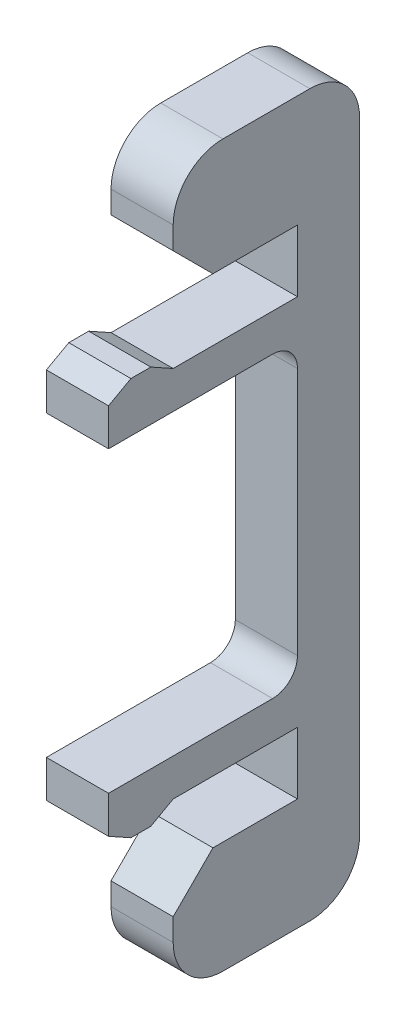
ISO-10303-21;
HEADER;
FILE_DESCRIPTION(('STEP AP214'),'2;1');
FILE_NAME('part.step','',(''),(''),'','','');
FILE_SCHEMA(('AUTOMOTIVE_DESIGN { 1 0 10303 214 1 1 1 1 }'));
ENDSEC;
DATA;
#1=APPLICATION_CONTEXT('core data for automotive mechanical design processes');
#2=APPLICATION_PROTOCOL_DEFINITION('international standard','automotive_design',2000,#1);
#3=PRODUCT_CONTEXT('',#1,'mechanical');
#4=PRODUCT('Part','Part','',(#3));
#5=PRODUCT_RELATED_PRODUCT_CATEGORY('part','',(#4));
#6=PRODUCT_DEFINITION_FORMATION('','',#4);
#7=PRODUCT_DEFINITION_CONTEXT('part definition',#1,'design');
#8=PRODUCT_DEFINITION('design','',#6,#7);
#9=PRODUCT_DEFINITION_SHAPE('','',#8);
#10=(LENGTH_UNIT() NAMED_UNIT(*) SI_UNIT(.MILLI.,.METRE.));
#11=(NAMED_UNIT(*) PLANE_ANGLE_UNIT() SI_UNIT($,.RADIAN.));
#12=(NAMED_UNIT(*) SI_UNIT($,.STERADIAN.) SOLID_ANGLE_UNIT());
#13=UNCERTAINTY_MEASURE_WITH_UNIT(LENGTH_MEASURE(1.E-05),#10,'distance_accuracy_value','');
#14=(GEOMETRIC_REPRESENTATION_CONTEXT(3) GLOBAL_UNCERTAINTY_ASSIGNED_CONTEXT((#13)) GLOBAL_UNIT_ASSIGNED_CONTEXT((#10,
#11,#12)) REPRESENTATION_CONTEXT('',''));
#15=CARTESIAN_POINT('',(0.,0.,0.));
#16=DIRECTION('',(0.,0.,1.));
#17=DIRECTION('',(1.,0.,0.));
#18=AXIS2_PLACEMENT_3D('',#15,#16,#17);
#19=CARTESIAN_POINT('',(0.,0.,3.175));
#20=DIRECTION('',(0.,0.,-1.));
#21=DIRECTION('',(-1.,0.,0.));
#22=AXIS2_PLACEMENT_3D('',#19,#20,#21);
#23=PLANE('',#22);
#24=DIRECTION('',(0.,-1.,0.));
#25=VECTOR('',#24,1.);
#26=CARTESIAN_POINT('',(-1.5875,-18.415,3.175));
#27=LINE('',#26,#25);
#28=CARTESIAN_POINT('',(-1.5875,12.7,3.175));
#29=VERTEX_POINT('',#28);
#30=CARTESIAN_POINT('',(-1.5875,9.525,3.175));
#31=VERTEX_POINT('',#30);
#32=EDGE_CURVE('E365',#29,#31,#27,.T.);
#33=ORIENTED_EDGE('',*,*,#32,.T.);
#34=DIRECTION('',(-1.,0.,0.));
#35=VECTOR('',#34,1.);
#36=CARTESIAN_POINT('',(11.5681164138294,9.525,3.175));
#37=LINE('',#36,#35);
#38=CARTESIAN_POINT('',(1.5875,9.525,3.175));
#39=VERTEX_POINT('',#38);
#40=EDGE_CURVE('E279',#39,#31,#37,.T.);
#41=ORIENTED_EDGE('',*,*,#40,.F.);
#42=DIRECTION('',(0.,1.,0.));
#43=VECTOR('',#42,1.);
#44=CARTESIAN_POINT('',(1.5875,-18.415,3.175));
#45=LINE('',#44,#43);
#46=CARTESIAN_POINT('',(1.5875,12.7,3.175));
#47=VERTEX_POINT('',#46);
#48=EDGE_CURVE('E364',#39,#47,#45,.T.);
#49=ORIENTED_EDGE('',*,*,#48,.T.);
#50=DIRECTION('',(-1.,0.,0.));
#51=VECTOR('',#50,1.);
#52=CARTESIAN_POINT('',(10.1305512698918,12.7,3.175));
#53=LINE('',#52,#51);
#54=EDGE_CURVE('E339',#47,#29,#53,.T.);
#55=ORIENTED_EDGE('',*,*,#54,.T.);
#56=EDGE_LOOP('',(#33,#41,#49,#55));
#57=FACE_BOUND('',#56,.T.);
#58=ADVANCED_FACE('F41',(#57),#23,.F.);
#59=CARTESIAN_POINT('',(-1.5875,6.35,3.175));
#60=VERTEX_POINT('',#59);
#61=CARTESIAN_POINT('',(-1.5875,-6.35,3.175));
#62=VERTEX_POINT('',#61);
#63=EDGE_CURVE('E368',#60,#62,#27,.T.);
#64=ORIENTED_EDGE('',*,*,#63,.T.);
#65=DIRECTION('',(-1.,0.,0.));
#66=VECTOR('',#65,1.);
#67=CARTESIAN_POINT('',(0.,-6.35,3.175));
#68=LINE('',#67,#66);
#69=CARTESIAN_POINT('',(1.5875,-6.35,3.175));
#70=VERTEX_POINT('',#69);
#71=EDGE_CURVE('E391',#62,#70,#68,.F.);
#72=ORIENTED_EDGE('',*,*,#71,.T.);
#73=CARTESIAN_POINT('',(1.5875,6.35,3.175));
#74=VERTEX_POINT('',#73);
#75=EDGE_CURVE('E363',#70,#74,#45,.T.);
#76=ORIENTED_EDGE('',*,*,#75,.T.);
#77=DIRECTION('',(-1.,0.,0.));
#78=VECTOR('',#77,1.);
#79=CARTESIAN_POINT('',(0.,6.35,3.175));
#80=LINE('',#79,#78);
#81=EDGE_CURVE('E388',#74,#60,#80,.T.);
#82=ORIENTED_EDGE('',*,*,#81,.T.);
#83=EDGE_LOOP('',(#64,#72,#76,#82));
#84=FACE_BOUND('',#83,.T.);
#85=ADVANCED_FACE('F497',(#84),#23,.F.);
#86=CARTESIAN_POINT('',(1.5875,-12.7,3.175));
#87=VERTEX_POINT('',#86);
#88=CARTESIAN_POINT('',(1.5875,-9.525,3.175));
#89=VERTEX_POINT('',#88);
#90=EDGE_CURVE('E360',#87,#89,#45,.T.);
#91=ORIENTED_EDGE('',*,*,#90,.T.);
#92=DIRECTION('',(-1.,0.,0.));
#93=VECTOR('',#92,1.);
#94=CARTESIAN_POINT('',(11.5681164138294,-9.525,3.175));
#95=LINE('',#94,#93);
#96=CARTESIAN_POINT('',(-1.5875,-9.525,3.175));
#97=VERTEX_POINT('',#96);
#98=EDGE_CURVE('E297',#89,#97,#95,.T.);
#99=ORIENTED_EDGE('',*,*,#98,.T.);
#100=CARTESIAN_POINT('',(-1.5875,-12.7,3.175));
#101=VERTEX_POINT('',#100);
#102=EDGE_CURVE('E362',#97,#101,#27,.T.);
#103=ORIENTED_EDGE('',*,*,#102,.T.);
#104=DIRECTION('',(-1.,0.,0.));
#105=VECTOR('',#104,1.);
#106=CARTESIAN_POINT('',(10.1305512698918,-12.7,3.175));
#107=LINE('',#106,#105);
#108=EDGE_CURVE('E350',#87,#101,#107,.T.);
#109=ORIENTED_EDGE('',*,*,#108,.F.);
#110=EDGE_LOOP('',(#91,#99,#103,#109));
#111=FACE_BOUND('',#110,.T.);
#112=ADVANCED_FACE('F499',(#111),#23,.F.);
#113=CARTESIAN_POINT('',(1.5875,-18.415,3.175));
#114=DIRECTION('',(-1.,0.,0.));
#115=DIRECTION('',(0.,0.,1.));
#116=AXIS2_PLACEMENT_3D('',#113,#114,#115);
#117=PLANE('',#116);
#118=DIRECTION('',(0.,0.,1.));
#119=VECTOR('',#118,1.);
#120=CARTESIAN_POINT('',(1.5875,-12.7,3.175));
#121=LINE('',#120,#119);
#122=CARTESIAN_POINT('',(1.5875,-12.7,7.49299999999999));
#123=VERTEX_POINT('',#122);
#124=EDGE_CURVE('E291',#87,#123,#121,.T.);
#125=ORIENTED_EDGE('',*,*,#124,.T.);
#126=DIRECTION('',(0.,0.707106781186546,-0.707106781186549));
#127=VECTOR('',#126,1.);
#128=CARTESIAN_POINT('',(1.5875,-14.732,9.525));
#129=LINE('',#128,#127);
#130=CARTESIAN_POINT('',(1.5875,-14.732,9.525));
#131=VERTEX_POINT('',#130);
#132=EDGE_CURVE('E449',#123,#131,#129,.F.);
#133=ORIENTED_EDGE('',*,*,#132,.T.);
#134=DIRECTION('',(0.,-1.,0.));
#135=VECTOR('',#134,1.);
#136=CARTESIAN_POINT('',(1.5875,-18.415,9.525));
#137=LINE('',#136,#135);
#138=CARTESIAN_POINT('',(1.5875,-15.875,9.525));
#139=VERTEX_POINT('',#138);
#140=EDGE_CURVE('E354',#131,#139,#137,.T.);
#141=ORIENTED_EDGE('',*,*,#140,.T.);
#142=CARTESIAN_POINT('',(1.5875,-15.875,6.985));
#143=DIRECTION('',(-1.,0.,0.));
#144=DIRECTION('',(0.,0.,1.));
#145=AXIS2_PLACEMENT_3D('',#142,#143,#144);
#146=CIRCLE('',#145,2.54);
#147=CARTESIAN_POINT('',(1.5875,-18.415,6.985));
#148=VERTEX_POINT('',#147);
#149=EDGE_CURVE('E425',#139,#148,#146,.F.);
#150=ORIENTED_EDGE('',*,*,#149,.T.);
#151=DIRECTION('',(0.,0.,-1.));
#152=VECTOR('',#151,1.);
#153=CARTESIAN_POINT('',(1.5875,-18.415,3.175));
#154=LINE('',#153,#152);
#155=CARTESIAN_POINT('',(1.5875,-18.415,2.54));
#156=VERTEX_POINT('',#155);
#157=EDGE_CURVE('E367',#148,#156,#154,.T.);
#158=ORIENTED_EDGE('',*,*,#157,.T.);
#159=CARTESIAN_POINT('',(1.5875,-15.875,2.54));
#160=DIRECTION('',(-1.,0.,0.));
#161=DIRECTION('',(0.,0.,1.));
#162=AXIS2_PLACEMENT_3D('',#159,#160,#161);
#163=CIRCLE('',#162,2.54);
#164=CARTESIAN_POINT('',(1.5875,-15.875,0.));
#165=VERTEX_POINT('',#164);
#166=EDGE_CURVE('E419',#156,#165,#163,.F.);
#167=ORIENTED_EDGE('',*,*,#166,.T.);
#168=DIRECTION('',(0.,1.,0.));
#169=VECTOR('',#168,1.);
#170=CARTESIAN_POINT('',(1.5875,-18.415,0.));
#171=LINE('',#170,#169);
#172=CARTESIAN_POINT('',(1.5875,15.875,0.));
#173=VERTEX_POINT('',#172);
#174=EDGE_CURVE('E349',#165,#173,#171,.T.);
#175=ORIENTED_EDGE('',*,*,#174,.T.);
#176=CARTESIAN_POINT('',(1.5875,15.875,2.54));
#177=DIRECTION('',(-1.,0.,0.));
#178=DIRECTION('',(0.,0.,1.));
#179=AXIS2_PLACEMENT_3D('',#176,#177,#178);
#180=CIRCLE('',#179,2.54);
#181=CARTESIAN_POINT('',(1.5875,18.415,2.54));
#182=VERTEX_POINT('',#181);
#183=EDGE_CURVE('E421',#173,#182,#180,.F.);
#184=ORIENTED_EDGE('',*,*,#183,.T.);
#185=DIRECTION('',(0.,0.,-1.));
#186=VECTOR('',#185,1.);
#187=CARTESIAN_POINT('',(1.5875,18.415,3.175));
#188=LINE('',#187,#186);
#189=CARTESIAN_POINT('',(1.5875,18.415,6.985));
#190=VERTEX_POINT('',#189);
#191=EDGE_CURVE('E382',#190,#182,#188,.T.);
#192=ORIENTED_EDGE('',*,*,#191,.F.);
#193=CARTESIAN_POINT('',(1.5875,15.875,6.985));
#194=DIRECTION('',(-1.,0.,0.));
#195=DIRECTION('',(0.,0.,1.));
#196=AXIS2_PLACEMENT_3D('',#193,#194,#195);
#197=CIRCLE('',#196,2.54);
#198=CARTESIAN_POINT('',(1.5875,15.875,9.525));
#199=VERTEX_POINT('',#198);
#200=EDGE_CURVE('E423',#190,#199,#197,.F.);
#201=ORIENTED_EDGE('',*,*,#200,.T.);
#202=DIRECTION('',(0.,-1.,0.));
#203=VECTOR('',#202,1.);
#204=CARTESIAN_POINT('',(1.5875,18.415,9.525));
#205=LINE('',#204,#203);
#206=CARTESIAN_POINT('',(1.5875,14.732,9.525));
#207=VERTEX_POINT('',#206);
#208=EDGE_CURVE('E336',#199,#207,#205,.T.);
#209=ORIENTED_EDGE('',*,*,#208,.T.);
#210=DIRECTION('',(0.,0.707106781186549,0.707106781186546));
#211=VECTOR('',#210,1.);
#212=CARTESIAN_POINT('',(1.5875,12.7,7.493));
#213=LINE('',#212,#211);
#214=CARTESIAN_POINT('',(1.5875,12.7,7.493));
#215=VERTEX_POINT('',#214);
#216=EDGE_CURVE('E57',#207,#215,#213,.F.);
#217=ORIENTED_EDGE('',*,*,#216,.T.);
#218=DIRECTION('',(0.,0.,-1.));
#219=VECTOR('',#218,1.);
#220=CARTESIAN_POINT('',(1.5875,12.7,3.175));
#221=LINE('',#220,#219);
#222=EDGE_CURVE('E338',#215,#47,#221,.T.);
#223=ORIENTED_EDGE('',*,*,#222,.T.);
#224=ORIENTED_EDGE('',*,*,#48,.F.);
#225=DIRECTION('',(0.,0.,1.));
#226=VECTOR('',#225,1.);
#227=CARTESIAN_POINT('',(1.5875,9.525,3.175));
#228=LINE('',#227,#226);
#229=CARTESIAN_POINT('',(1.5875,9.525,9.525));
#230=VERTEX_POINT('',#229);
#231=EDGE_CURVE('E292',#39,#230,#228,.T.);
#232=ORIENTED_EDGE('',*,*,#231,.T.);
#233=DIRECTION('',(0.,0.485642931178632,0.874157276121538));
#234=VECTOR('',#233,1.);
#235=CARTESIAN_POINT('',(1.5875,9.525,9.525));
#236=LINE('',#235,#234);
#237=CARTESIAN_POINT('',(1.5875,10.16,10.668));
#238=VERTEX_POINT('',#237);
#239=EDGE_CURVE('E466',#230,#238,#236,.T.);
#240=ORIENTED_EDGE('',*,*,#239,.T.);
#241=DIRECTION('',(0.,0.,1.));
#242=VECTOR('',#241,1.);
#243=CARTESIAN_POINT('',(1.5875,10.16,10.668));
#244=LINE('',#243,#242);
#245=CARTESIAN_POINT('',(1.5875,10.16,11.684));
#246=VERTEX_POINT('',#245);
#247=EDGE_CURVE('E467',#238,#246,#244,.T.);
#248=ORIENTED_EDGE('',*,*,#247,.T.);
#249=DIRECTION('',(0.,-0.485642931178633,0.874157276121537));
#250=VECTOR('',#249,1.);
#251=CARTESIAN_POINT('',(1.5875,10.16,11.684));
#252=LINE('',#251,#250);
#253=CARTESIAN_POINT('',(1.5875,9.525,12.827));
#254=VERTEX_POINT('',#253);
#255=EDGE_CURVE('E471',#246,#254,#252,.T.);
#256=ORIENTED_EDGE('',*,*,#255,.T.);
#257=DIRECTION('',(0.,-1.,0.));
#258=VECTOR('',#257,1.);
#259=CARTESIAN_POINT('',(1.5875,9.525,12.827));
#260=LINE('',#259,#258);
#261=CARTESIAN_POINT('',(1.5875,7.62,12.827));
#262=VERTEX_POINT('',#261);
#263=EDGE_CURVE('E282',#254,#262,#260,.T.);
#264=ORIENTED_EDGE('',*,*,#263,.T.);
#265=DIRECTION('',(0.,0.,-1.));
#266=VECTOR('',#265,1.);
#267=CARTESIAN_POINT('',(1.5875,7.62,12.827));
#268=LINE('',#267,#266);
#269=CARTESIAN_POINT('',(1.5875,7.62,4.445));
#270=VERTEX_POINT('',#269);
#271=EDGE_CURVE('E257',#262,#270,#268,.T.);
#272=ORIENTED_EDGE('',*,*,#271,.T.);
#273=CARTESIAN_POINT('',(1.5875,6.35,4.445));
#274=DIRECTION('',(-1.,0.,0.));
#275=DIRECTION('',(0.,0.,1.));
#276=AXIS2_PLACEMENT_3D('',#273,#274,#275);
#277=CIRCLE('',#276,1.27);
#278=EDGE_CURVE('E400',#270,#74,#277,.T.);
#279=ORIENTED_EDGE('',*,*,#278,.T.);
#280=ORIENTED_EDGE('',*,*,#75,.F.);
#281=CARTESIAN_POINT('',(1.5875,-6.35,4.445));
#282=DIRECTION('',(-1.,0.,0.));
#283=DIRECTION('',(0.,0.,1.));
#284=AXIS2_PLACEMENT_3D('',#281,#282,#283);
#285=CIRCLE('',#284,1.27);
#286=CARTESIAN_POINT('',(1.5875,-7.62,4.445));
#287=VERTEX_POINT('',#286);
#288=EDGE_CURVE('E397',#70,#287,#285,.T.);
#289=ORIENTED_EDGE('',*,*,#288,.T.);
#290=DIRECTION('',(0.,0.,1.));
#291=VECTOR('',#290,1.);
#292=CARTESIAN_POINT('',(1.5875,-7.62,12.827));
#293=LINE('',#292,#291);
#294=CARTESIAN_POINT('',(1.5875,-7.62,12.827));
#295=VERTEX_POINT('',#294);
#296=EDGE_CURVE('E296',#287,#295,#293,.T.);
#297=ORIENTED_EDGE('',*,*,#296,.T.);
#298=DIRECTION('',(0.,-1.,0.));
#299=VECTOR('',#298,1.);
#300=CARTESIAN_POINT('',(1.5875,-9.525,12.827));
#301=LINE('',#300,#299);
#302=CARTESIAN_POINT('',(1.5875,-9.525,12.827));
#303=VERTEX_POINT('',#302);
#304=EDGE_CURVE('E329',#295,#303,#301,.T.);
#305=ORIENTED_EDGE('',*,*,#304,.T.);
#306=DIRECTION('',(0.,-0.485642931178633,-0.874157276121537));
#307=VECTOR('',#306,1.);
#308=CARTESIAN_POINT('',(1.5875,-10.16,11.684));
#309=LINE('',#308,#307);
#310=CARTESIAN_POINT('',(1.5875,-10.16,11.684));
#311=VERTEX_POINT('',#310);
#312=EDGE_CURVE('E331',#303,#311,#309,.T.);
#313=ORIENTED_EDGE('',*,*,#312,.T.);
#314=DIRECTION('',(0.,0.,-1.));
#315=VECTOR('',#314,1.);
#316=CARTESIAN_POINT('',(1.5875,-10.16,10.668));
#317=LINE('',#316,#315);
#318=CARTESIAN_POINT('',(1.5875,-10.16,10.668));
#319=VERTEX_POINT('',#318);
#320=EDGE_CURVE('E333',#311,#319,#317,.T.);
#321=ORIENTED_EDGE('',*,*,#320,.T.);
#322=DIRECTION('',(0.,0.485642931178632,-0.874157276121538));
#323=VECTOR('',#322,1.);
#324=CARTESIAN_POINT('',(1.5875,-9.525,9.525));
#325=LINE('',#324,#323);
#326=CARTESIAN_POINT('',(1.5875,-9.525,9.525));
#327=VERTEX_POINT('',#326);
#328=EDGE_CURVE('E311',#319,#327,#325,.T.);
#329=ORIENTED_EDGE('',*,*,#328,.T.);
#330=DIRECTION('',(0.,0.,-1.));
#331=VECTOR('',#330,1.);
#332=CARTESIAN_POINT('',(1.5875,-9.525,3.175));
#333=LINE('',#332,#331);
#334=EDGE_CURVE('E293',#327,#89,#333,.T.);
#335=ORIENTED_EDGE('',*,*,#334,.T.);
#336=ORIENTED_EDGE('',*,*,#90,.F.);
#337=EDGE_LOOP('',(#125,#133,#141,#150,#158,#167,#175,#184,#192,#201,#209,#217,#223,#224,#232,
#240,#248,#256,#264,#272,#279,#280,#289,#297,#305,#313,#321,#329,#335,#336));
#338=FACE_BOUND('',#337,.T.);
#339=ADVANCED_FACE('F473',(#338),#117,.F.);
#340=CARTESIAN_POINT('',(-1.5875,18.415,3.175));
#341=DIRECTION('',(0.,-1.,0.));
#342=DIRECTION('',(0.,0.,-1.));
#343=AXIS2_PLACEMENT_3D('',#340,#341,#342);
#344=PLANE('',#343);
#345=DIRECTION('',(0.,0.,-1.));
#346=VECTOR('',#345,1.);
#347=CARTESIAN_POINT('',(-1.5875,18.415,3.175));
#348=LINE('',#347,#346);
#349=CARTESIAN_POINT('',(-1.5875,18.415,6.985));
#350=VERTEX_POINT('',#349);
#351=CARTESIAN_POINT('',(-1.5875,18.415,2.54));
#352=VERTEX_POINT('',#351);
#353=EDGE_CURVE('E379',#350,#352,#348,.T.);
#354=ORIENTED_EDGE('',*,*,#353,.F.);
#355=DIRECTION('',(-1.,0.,0.));
#356=VECTOR('',#355,1.);
#357=CARTESIAN_POINT('',(1.5875,18.415,6.985));
#358=LINE('',#357,#356);
#359=EDGE_CURVE('E433',#350,#190,#358,.F.);
#360=ORIENTED_EDGE('',*,*,#359,.T.);
#361=ORIENTED_EDGE('',*,*,#191,.T.);
#362=DIRECTION('',(-1.,0.,0.));
#363=VECTOR('',#362,1.);
#364=CARTESIAN_POINT('',(-1.5875,18.415,2.54));
#365=LINE('',#364,#363);
#366=EDGE_CURVE('E430',#182,#352,#365,.T.);
#367=ORIENTED_EDGE('',*,*,#366,.T.);
#368=EDGE_LOOP('',(#354,#360,#361,#367));
#369=FACE_BOUND('',#368,.T.);
#370=ADVANCED_FACE('F512',(#369),#344,.F.);
#371=CARTESIAN_POINT('',(-1.5875,-18.415,3.175));
#372=DIRECTION('',(1.,0.,0.));
#373=DIRECTION('',(0.,0.,-1.));
#374=AXIS2_PLACEMENT_3D('',#371,#372,#373);
#375=PLANE('',#374);
#376=DIRECTION('',(0.,1.,0.));
#377=VECTOR('',#376,1.);
#378=CARTESIAN_POINT('',(-1.5875,-18.415,9.525));
#379=LINE('',#378,#377);
#380=CARTESIAN_POINT('',(-1.5875,-15.875,9.525));
#381=VERTEX_POINT('',#380);
#382=CARTESIAN_POINT('',(-1.5875,-14.732,9.525));
#383=VERTEX_POINT('',#382);
#384=EDGE_CURVE('E344',#381,#383,#379,.T.);
#385=ORIENTED_EDGE('',*,*,#384,.T.);
#386=DIRECTION('',(0.,-0.707106781186546,0.707106781186549));
#387=VECTOR('',#386,1.);
#388=CARTESIAN_POINT('',(-1.5875,-14.732,9.525));
#389=LINE('',#388,#387);
#390=CARTESIAN_POINT('',(-1.5875,-12.7,7.49299999999999));
#391=VERTEX_POINT('',#390);
#392=EDGE_CURVE('E444',#383,#391,#389,.F.);
#393=ORIENTED_EDGE('',*,*,#392,.T.);
#394=DIRECTION('',(0.,0.,-1.));
#395=VECTOR('',#394,1.);
#396=CARTESIAN_POINT('',(-1.5875,-12.7,3.175));
#397=LINE('',#396,#395);
#398=EDGE_CURVE('E353',#391,#101,#397,.T.);
#399=ORIENTED_EDGE('',*,*,#398,.T.);
#400=ORIENTED_EDGE('',*,*,#102,.F.);
#401=DIRECTION('',(0.,0.,1.));
#402=VECTOR('',#401,1.);
#403=CARTESIAN_POINT('',(-1.5875,-9.525,3.175));
#404=LINE('',#403,#402);
#405=CARTESIAN_POINT('',(-1.5875,-9.525,9.525));
#406=VERTEX_POINT('',#405);
#407=EDGE_CURVE('E250',#97,#406,#404,.T.);
#408=ORIENTED_EDGE('',*,*,#407,.T.);
#409=DIRECTION('',(0.,-0.485642931178632,0.874157276121538));
#410=VECTOR('',#409,1.);
#411=CARTESIAN_POINT('',(-1.5875,-9.525,9.525));
#412=LINE('',#411,#410);
#413=CARTESIAN_POINT('',(-1.5875,-10.16,10.668));
#414=VERTEX_POINT('',#413);
#415=EDGE_CURVE('E323',#406,#414,#412,.T.);
#416=ORIENTED_EDGE('',*,*,#415,.T.);
#417=DIRECTION('',(0.,0.,1.));
#418=VECTOR('',#417,1.);
#419=CARTESIAN_POINT('',(-1.5875,-10.16,10.668));
#420=LINE('',#419,#418);
#421=CARTESIAN_POINT('',(-1.5875,-10.16,11.684));
#422=VERTEX_POINT('',#421);
#423=EDGE_CURVE('E320',#414,#422,#420,.T.);
#424=ORIENTED_EDGE('',*,*,#423,.T.);
#425=DIRECTION('',(0.,0.485642931178633,0.874157276121537));
#426=VECTOR('',#425,1.);
#427=CARTESIAN_POINT('',(-1.5875,-10.16,11.684));
#428=LINE('',#427,#426);
#429=CARTESIAN_POINT('',(-1.5875,-9.525,12.827));
#430=VERTEX_POINT('',#429);
#431=EDGE_CURVE('E317',#422,#430,#428,.T.);
#432=ORIENTED_EDGE('',*,*,#431,.T.);
#433=DIRECTION('',(0.,1.,0.));
#434=VECTOR('',#433,1.);
#435=CARTESIAN_POINT('',(-1.5875,-9.525,12.827));
#436=LINE('',#435,#434);
#437=CARTESIAN_POINT('',(-1.5875,-7.62,12.827));
#438=VERTEX_POINT('',#437);
#439=EDGE_CURVE('E314',#430,#438,#436,.T.);
#440=ORIENTED_EDGE('',*,*,#439,.T.);
#441=DIRECTION('',(0.,0.,-1.));
#442=VECTOR('',#441,1.);
#443=CARTESIAN_POINT('',(-1.5875,-7.62,12.827));
#444=LINE('',#443,#442);
#445=CARTESIAN_POINT('',(-1.5875,-7.62,4.445));
#446=VERTEX_POINT('',#445);
#447=EDGE_CURVE('E300',#438,#446,#444,.T.);
#448=ORIENTED_EDGE('',*,*,#447,.T.);
#449=CARTESIAN_POINT('',(-1.5875,-6.35,4.445));
#450=DIRECTION('',(1.,0.,0.));
#451=DIRECTION('',(0.,0.,-1.));
#452=AXIS2_PLACEMENT_3D('',#449,#450,#451);
#453=CIRCLE('',#452,1.27);
#454=EDGE_CURVE('E395',#446,#62,#453,.T.);
#455=ORIENTED_EDGE('',*,*,#454,.T.);
#456=ORIENTED_EDGE('',*,*,#63,.F.);
#457=CARTESIAN_POINT('',(-1.5875,6.35,4.445));
#458=DIRECTION('',(1.,0.,0.));
#459=DIRECTION('',(0.,0.,-1.));
#460=AXIS2_PLACEMENT_3D('',#457,#458,#459);
#461=CIRCLE('',#460,1.27);
#462=CARTESIAN_POINT('',(-1.5875,7.62,4.445));
#463=VERTEX_POINT('',#462);
#464=EDGE_CURVE('E247',#60,#463,#461,.T.);
#465=ORIENTED_EDGE('',*,*,#464,.T.);
#466=DIRECTION('',(0.,0.,1.));
#467=VECTOR('',#466,1.);
#468=CARTESIAN_POINT('',(-1.5875,7.62,12.827));
#469=LINE('',#468,#467);
#470=CARTESIAN_POINT('',(-1.5875,7.62,12.827));
#471=VERTEX_POINT('',#470);
#472=EDGE_CURVE('E239',#463,#471,#469,.T.);
#473=ORIENTED_EDGE('',*,*,#472,.T.);
#474=DIRECTION('',(0.,1.,0.));
#475=VECTOR('',#474,1.);
#476=CARTESIAN_POINT('',(-1.5875,9.525,12.827));
#477=LINE('',#476,#475);
#478=CARTESIAN_POINT('',(-1.5875,9.525,12.827));
#479=VERTEX_POINT('',#478);
#480=EDGE_CURVE('E245',#471,#479,#477,.T.);
#481=ORIENTED_EDGE('',*,*,#480,.T.);
#482=DIRECTION('',(0.,0.485642931178633,-0.874157276121537));
#483=VECTOR('',#482,1.);
#484=CARTESIAN_POINT('',(-1.5875,10.16,11.684));
#485=LINE('',#484,#483);
#486=CARTESIAN_POINT('',(-1.5875,10.16,11.684));
#487=VERTEX_POINT('',#486);
#488=EDGE_CURVE('E266',#479,#487,#485,.T.);
#489=ORIENTED_EDGE('',*,*,#488,.T.);
#490=DIRECTION('',(0.,0.,-1.));
#491=VECTOR('',#490,1.);
#492=CARTESIAN_POINT('',(-1.5875,10.16,10.668));
#493=LINE('',#492,#491);
#494=CARTESIAN_POINT('',(-1.5875,10.16,10.668));
#495=VERTEX_POINT('',#494);
#496=EDGE_CURVE('E268',#487,#495,#493,.T.);
#497=ORIENTED_EDGE('',*,*,#496,.T.);
#498=DIRECTION('',(0.,-0.485642931178632,-0.874157276121538));
#499=VECTOR('',#498,1.);
#500=CARTESIAN_POINT('',(-1.5875,9.525,9.525));
#501=LINE('',#500,#499);
#502=CARTESIAN_POINT('',(-1.5875,9.525,9.525));
#503=VERTEX_POINT('',#502);
#504=EDGE_CURVE('E274',#495,#503,#501,.T.);
#505=ORIENTED_EDGE('',*,*,#504,.T.);
#506=DIRECTION('',(0.,0.,-1.));
#507=VECTOR('',#506,1.);
#508=CARTESIAN_POINT('',(-1.5875,9.525,3.175));
#509=LINE('',#508,#507);
#510=EDGE_CURVE('E261',#503,#31,#509,.T.);
#511=ORIENTED_EDGE('',*,*,#510,.T.);
#512=ORIENTED_EDGE('',*,*,#32,.F.);
#513=DIRECTION('',(0.,0.,1.));
#514=VECTOR('',#513,1.);
#515=CARTESIAN_POINT('',(-1.5875,12.7,3.175));
#516=LINE('',#515,#514);
#517=CARTESIAN_POINT('',(-1.5875,12.7,7.493));
#518=VERTEX_POINT('',#517);
#519=EDGE_CURVE('E340',#29,#518,#516,.T.);
#520=ORIENTED_EDGE('',*,*,#519,.T.);
#521=DIRECTION('',(0.,-0.707106781186549,-0.707106781186546));
#522=VECTOR('',#521,1.);
#523=CARTESIAN_POINT('',(-1.5875,12.7,7.493));
#524=LINE('',#523,#522);
#525=CARTESIAN_POINT('',(-1.5875,14.732,9.525));
#526=VERTEX_POINT('',#525);
#527=EDGE_CURVE('E442',#518,#526,#524,.F.);
#528=ORIENTED_EDGE('',*,*,#527,.T.);
#529=DIRECTION('',(0.,1.,0.));
#530=VECTOR('',#529,1.);
#531=CARTESIAN_POINT('',(-1.5875,18.415,9.525));
#532=LINE('',#531,#530);
#533=CARTESIAN_POINT('',(-1.5875,15.875,9.525));
#534=VERTEX_POINT('',#533);
#535=EDGE_CURVE('E343',#526,#534,#532,.T.);
#536=ORIENTED_EDGE('',*,*,#535,.T.);
#537=CARTESIAN_POINT('',(-1.5875,15.875,6.985));
#538=DIRECTION('',(1.,0.,0.));
#539=DIRECTION('',(0.,0.,-1.));
#540=AXIS2_PLACEMENT_3D('',#537,#538,#539);
#541=CIRCLE('',#540,2.54);
#542=EDGE_CURVE('E412',#534,#350,#541,.F.);
#543=ORIENTED_EDGE('',*,*,#542,.T.);
#544=ORIENTED_EDGE('',*,*,#353,.T.);
#545=CARTESIAN_POINT('',(-1.5875,15.875,2.54));
#546=DIRECTION('',(1.,0.,0.));
#547=DIRECTION('',(0.,0.,-1.));
#548=AXIS2_PLACEMENT_3D('',#545,#546,#547);
#549=CIRCLE('',#548,2.54);
#550=CARTESIAN_POINT('',(-1.5875,15.875,0.));
#551=VERTEX_POINT('',#550);
#552=EDGE_CURVE('E410',#352,#551,#549,.F.);
#553=ORIENTED_EDGE('',*,*,#552,.T.);
#554=DIRECTION('',(0.,-1.,0.));
#555=VECTOR('',#554,1.);
#556=CARTESIAN_POINT('',(-1.5875,-18.415,0.));
#557=LINE('',#556,#555);
#558=CARTESIAN_POINT('',(-1.5875,-15.875,0.));
#559=VERTEX_POINT('',#558);
#560=EDGE_CURVE('E371',#551,#559,#557,.T.);
#561=ORIENTED_EDGE('',*,*,#560,.T.);
#562=CARTESIAN_POINT('',(-1.5875,-15.875,2.54));
#563=DIRECTION('',(1.,0.,0.));
#564=DIRECTION('',(0.,0.,-1.));
#565=AXIS2_PLACEMENT_3D('',#562,#563,#564);
#566=CIRCLE('',#565,2.54);
#567=CARTESIAN_POINT('',(-1.5875,-18.415,2.54));
#568=VERTEX_POINT('',#567);
#569=EDGE_CURVE('E408',#559,#568,#566,.F.);
#570=ORIENTED_EDGE('',*,*,#569,.T.);
#571=DIRECTION('',(0.,0.,-1.));
#572=VECTOR('',#571,1.);
#573=CARTESIAN_POINT('',(-1.5875,-18.415,3.175));
#574=LINE('',#573,#572);
#575=CARTESIAN_POINT('',(-1.5875,-18.415,6.985));
#576=VERTEX_POINT('',#575);
#577=EDGE_CURVE('E376',#576,#568,#574,.T.);
#578=ORIENTED_EDGE('',*,*,#577,.F.);
#579=CARTESIAN_POINT('',(-1.5875,-15.875,6.985));
#580=DIRECTION('',(1.,0.,0.));
#581=DIRECTION('',(0.,0.,-1.));
#582=AXIS2_PLACEMENT_3D('',#579,#580,#581);
#583=CIRCLE('',#582,2.54);
#584=EDGE_CURVE('E414',#576,#381,#583,.F.);
#585=ORIENTED_EDGE('',*,*,#584,.T.);
#586=EDGE_LOOP('',(#385,#393,#399,#400,#408,#416,#424,#432,#440,#448,#455,#456,#465,#473,#481,
#489,#497,#505,#511,#512,#520,#528,#536,#543,#544,#553,#561,#570,#578,#585));
#587=FACE_BOUND('',#586,.T.);
#588=ADVANCED_FACE('F242',(#587),#375,.F.);
#589=CARTESIAN_POINT('',(-1.5875,-18.415,3.175));
#590=DIRECTION('',(0.,1.,0.));
#591=DIRECTION('',(0.,0.,1.));
#592=AXIS2_PLACEMENT_3D('',#589,#590,#591);
#593=PLANE('',#592);
#594=ORIENTED_EDGE('',*,*,#157,.F.);
#595=DIRECTION('',(-1.,0.,0.));
#596=VECTOR('',#595,1.);
#597=CARTESIAN_POINT('',(-1.5875,-18.415,6.985));
#598=LINE('',#597,#596);
#599=EDGE_CURVE('E405',#148,#576,#598,.T.);
#600=ORIENTED_EDGE('',*,*,#599,.T.);
#601=ORIENTED_EDGE('',*,*,#577,.T.);
#602=DIRECTION('',(1.,0.,0.));
#603=VECTOR('',#602,1.);
#604=CARTESIAN_POINT('',(1.5875,-18.415,2.54));
#605=LINE('',#604,#603);
#606=EDGE_CURVE('E402',#568,#156,#605,.T.);
#607=ORIENTED_EDGE('',*,*,#606,.T.);
#608=EDGE_LOOP('',(#594,#600,#601,#607));
#609=FACE_BOUND('',#608,.T.);
#610=ADVANCED_FACE('F587',(#609),#593,.F.);
#611=CARTESIAN_POINT('',(0.,0.,0.));
#612=DIRECTION('',(0.,0.,-1.));
#613=DIRECTION('',(-1.,0.,0.));
#614=AXIS2_PLACEMENT_3D('',#611,#612,#613);
#615=PLANE('',#614);
#616=ORIENTED_EDGE('',*,*,#560,.F.);
#617=DIRECTION('',(-1.,0.,0.));
#618=VECTOR('',#617,1.);
#619=CARTESIAN_POINT('',(1.5875,15.875,0.));
#620=LINE('',#619,#618);
#621=EDGE_CURVE('E437',#551,#173,#620,.F.);
#622=ORIENTED_EDGE('',*,*,#621,.T.);
#623=ORIENTED_EDGE('',*,*,#174,.F.);
#624=DIRECTION('',(1.,0.,0.));
#625=VECTOR('',#624,1.);
#626=CARTESIAN_POINT('',(-1.5875,-15.875,0.));
#627=LINE('',#626,#625);
#628=EDGE_CURVE('E435',#165,#559,#627,.F.);
#629=ORIENTED_EDGE('',*,*,#628,.T.);
#630=EDGE_LOOP('',(#616,#622,#623,#629));
#631=FACE_BOUND('',#630,.T.);
#632=ADVANCED_FACE('F581',(#631),#615,.T.);
#633=CARTESIAN_POINT('',(10.1305512698918,-12.7,3.175));
#634=DIRECTION('',(0.,1.,0.));
#635=DIRECTION('',(0.,0.,1.));
#636=AXIS2_PLACEMENT_3D('',#633,#634,#635);
#637=PLANE('',#636);
#638=ORIENTED_EDGE('',*,*,#398,.F.);
#639=DIRECTION('',(1.,0.,0.));
#640=VECTOR('',#639,1.);
#641=CARTESIAN_POINT('',(10.1305512698918,-12.7,7.49299999999999));
#642=LINE('',#641,#640);
#643=EDGE_CURVE('E446',#391,#123,#642,.T.);
#644=ORIENTED_EDGE('',*,*,#643,.T.);
#645=ORIENTED_EDGE('',*,*,#124,.F.);
#646=ORIENTED_EDGE('',*,*,#108,.T.);
#647=EDGE_LOOP('',(#638,#644,#645,#646));
#648=FACE_BOUND('',#647,.T.);
#649=ADVANCED_FACE('F578',(#648),#637,.T.);
#650=CARTESIAN_POINT('',(10.1305512698918,-18.415,9.525));
#651=DIRECTION('',(0.,0.,1.));
#652=DIRECTION('',(1.,0.,0.));
#653=AXIS2_PLACEMENT_3D('',#650,#651,#652);
#654=PLANE('',#653);
#655=ORIENTED_EDGE('',*,*,#140,.F.);
#656=DIRECTION('',(-1.,0.,0.));
#657=VECTOR('',#656,1.);
#658=CARTESIAN_POINT('',(10.1305512698918,-14.732,9.525));
#659=LINE('',#658,#657);
#660=EDGE_CURVE('E439',#131,#383,#659,.T.);
#661=ORIENTED_EDGE('',*,*,#660,.T.);
#662=ORIENTED_EDGE('',*,*,#384,.F.);
#663=DIRECTION('',(-1.,0.,0.));
#664=VECTOR('',#663,1.);
#665=CARTESIAN_POINT('',(1.5875,-15.875,9.525));
#666=LINE('',#665,#664);
#667=EDGE_CURVE('E416',#381,#139,#666,.F.);
#668=ORIENTED_EDGE('',*,*,#667,.T.);
#669=EDGE_LOOP('',(#655,#661,#662,#668));
#670=FACE_BOUND('',#669,.T.);
#671=ADVANCED_FACE('F574',(#670),#654,.T.);
#672=CARTESIAN_POINT('',(10.1305512698918,18.415,9.525));
#673=DIRECTION('',(0.,0.,1.));
#674=DIRECTION('',(1.,0.,0.));
#675=AXIS2_PLACEMENT_3D('',#672,#673,#674);
#676=PLANE('',#675);
#677=ORIENTED_EDGE('',*,*,#535,.F.);
#678=DIRECTION('',(1.,0.,0.));
#679=VECTOR('',#678,1.);
#680=CARTESIAN_POINT('',(10.1305512698918,14.732,9.525));
#681=LINE('',#680,#679);
#682=EDGE_CURVE('E11',#526,#207,#681,.T.);
#683=ORIENTED_EDGE('',*,*,#682,.T.);
#684=ORIENTED_EDGE('',*,*,#208,.F.);
#685=DIRECTION('',(-1.,0.,0.));
#686=VECTOR('',#685,1.);
#687=CARTESIAN_POINT('',(-1.5875,15.875,9.525));
#688=LINE('',#687,#686);
#689=EDGE_CURVE('E427',#199,#534,#688,.T.);
#690=ORIENTED_EDGE('',*,*,#689,.T.);
#691=EDGE_LOOP('',(#677,#683,#684,#690));
#692=FACE_BOUND('',#691,.T.);
#693=ADVANCED_FACE('F571',(#692),#676,.T.);
#694=CARTESIAN_POINT('',(10.1305512698918,12.7,3.175));
#695=DIRECTION('',(0.,-1.,0.));
#696=DIRECTION('',(0.,0.,-1.));
#697=AXIS2_PLACEMENT_3D('',#694,#695,#696);
#698=PLANE('',#697);
#699=ORIENTED_EDGE('',*,*,#222,.F.);
#700=DIRECTION('',(-1.,0.,0.));
#701=VECTOR('',#700,1.);
#702=CARTESIAN_POINT('',(10.1305512698918,12.7,7.493));
#703=LINE('',#702,#701);
#704=EDGE_CURVE('E50',#215,#518,#703,.T.);
#705=ORIENTED_EDGE('',*,*,#704,.T.);
#706=ORIENTED_EDGE('',*,*,#519,.F.);
#707=ORIENTED_EDGE('',*,*,#54,.F.);
#708=EDGE_LOOP('',(#699,#705,#706,#707));
#709=FACE_BOUND('',#708,.T.);
#710=ADVANCED_FACE('F453',(#709),#698,.T.);
#711=CARTESIAN_POINT('',(11.5681164138294,-7.62,12.827));
#712=DIRECTION('',(0.,1.,0.));
#713=DIRECTION('',(0.,0.,1.));
#714=AXIS2_PLACEMENT_3D('',#711,#712,#713);
#715=PLANE('',#714);
#716=ORIENTED_EDGE('',*,*,#296,.F.);
#717=DIRECTION('',(-1.,0.,0.));
#718=VECTOR('',#717,1.);
#719=CARTESIAN_POINT('',(11.5681164138294,-7.62,4.445));
#720=LINE('',#719,#718);
#721=EDGE_CURVE('E385',#287,#446,#720,.T.);
#722=ORIENTED_EDGE('',*,*,#721,.T.);
#723=ORIENTED_EDGE('',*,*,#447,.F.);
#724=DIRECTION('',(-1.,0.,0.));
#725=VECTOR('',#724,1.);
#726=CARTESIAN_POINT('',(11.5681164138294,-7.62,12.827));
#727=LINE('',#726,#725);
#728=EDGE_CURVE('E309',#295,#438,#727,.T.);
#729=ORIENTED_EDGE('',*,*,#728,.F.);
#730=EDGE_LOOP('',(#716,#722,#723,#729));
#731=FACE_BOUND('',#730,.T.);
#732=ADVANCED_FACE('F538',(#731),#715,.T.);
#733=CARTESIAN_POINT('',(11.5681164138294,-9.525,12.827));
#734=DIRECTION('',(0.,0.,1.));
#735=DIRECTION('',(1.,0.,0.));
#736=AXIS2_PLACEMENT_3D('',#733,#734,#735);
#737=PLANE('',#736);
#738=ORIENTED_EDGE('',*,*,#304,.F.);
#739=ORIENTED_EDGE('',*,*,#728,.T.);
#740=ORIENTED_EDGE('',*,*,#439,.F.);
#741=DIRECTION('',(-1.,0.,0.));
#742=VECTOR('',#741,1.);
#743=CARTESIAN_POINT('',(11.5681164138294,-9.525,12.827));
#744=LINE('',#743,#742);
#745=EDGE_CURVE('E307',#303,#430,#744,.T.);
#746=ORIENTED_EDGE('',*,*,#745,.F.);
#747=EDGE_LOOP('',(#738,#739,#740,#746));
#748=FACE_BOUND('',#747,.T.);
#749=ADVANCED_FACE('F542',(#748),#737,.T.);
#750=CARTESIAN_POINT('',(11.5681164138294,-10.16,11.684));
#751=DIRECTION('',(0.,-0.874157276121537,0.485642931178633));
#752=DIRECTION('',(0.,-0.485642931178633,-0.874157276121537));
#753=AXIS2_PLACEMENT_3D('',#750,#751,#752);
#754=PLANE('',#753);
#755=ORIENTED_EDGE('',*,*,#312,.F.);
#756=ORIENTED_EDGE('',*,*,#745,.T.);
#757=ORIENTED_EDGE('',*,*,#431,.F.);
#758=DIRECTION('',(-1.,0.,0.));
#759=VECTOR('',#758,1.);
#760=CARTESIAN_POINT('',(11.5681164138294,-10.16,11.684));
#761=LINE('',#760,#759);
#762=EDGE_CURVE('E305',#311,#422,#761,.T.);
#763=ORIENTED_EDGE('',*,*,#762,.F.);
#764=EDGE_LOOP('',(#755,#756,#757,#763));
#765=FACE_BOUND('',#764,.T.);
#766=ADVANCED_FACE('F549',(#765),#754,.T.);
#767=CARTESIAN_POINT('',(11.5681164138294,-10.16,10.668));
#768=DIRECTION('',(0.,-1.,0.));
#769=DIRECTION('',(0.,0.,-1.));
#770=AXIS2_PLACEMENT_3D('',#767,#768,#769);
#771=PLANE('',#770);
#772=ORIENTED_EDGE('',*,*,#320,.F.);
#773=ORIENTED_EDGE('',*,*,#762,.T.);
#774=ORIENTED_EDGE('',*,*,#423,.F.);
#775=DIRECTION('',(-1.,0.,0.));
#776=VECTOR('',#775,1.);
#777=CARTESIAN_POINT('',(11.5681164138294,-10.16,10.668));
#778=LINE('',#777,#776);
#779=EDGE_CURVE('E303',#319,#414,#778,.T.);
#780=ORIENTED_EDGE('',*,*,#779,.F.);
#781=EDGE_LOOP('',(#772,#773,#774,#780));
#782=FACE_BOUND('',#781,.T.);
#783=ADVANCED_FACE('F553',(#782),#771,.T.);
#784=CARTESIAN_POINT('',(11.5681164138294,-9.525,9.525));
#785=DIRECTION('',(0.,-0.874157276121538,-0.485642931178632));
#786=DIRECTION('',(0.,0.485642931178632,-0.874157276121538));
#787=AXIS2_PLACEMENT_3D('',#784,#785,#786);
#788=PLANE('',#787);
#789=ORIENTED_EDGE('',*,*,#328,.F.);
#790=ORIENTED_EDGE('',*,*,#779,.T.);
#791=ORIENTED_EDGE('',*,*,#415,.F.);
#792=DIRECTION('',(-1.,0.,0.));
#793=VECTOR('',#792,1.);
#794=CARTESIAN_POINT('',(11.5681164138294,-9.525,9.525));
#795=LINE('',#794,#793);
#796=EDGE_CURVE('E301',#327,#406,#795,.T.);
#797=ORIENTED_EDGE('',*,*,#796,.F.);
#798=EDGE_LOOP('',(#789,#790,#791,#797));
#799=FACE_BOUND('',#798,.T.);
#800=ADVANCED_FACE('F555',(#799),#788,.T.);
#801=CARTESIAN_POINT('',(11.5681164138294,-9.525,3.175));
#802=DIRECTION('',(0.,-1.,0.));
#803=DIRECTION('',(0.,0.,-1.));
#804=AXIS2_PLACEMENT_3D('',#801,#802,#803);
#805=PLANE('',#804);
#806=ORIENTED_EDGE('',*,*,#334,.F.);
#807=ORIENTED_EDGE('',*,*,#796,.T.);
#808=ORIENTED_EDGE('',*,*,#407,.F.);
#809=ORIENTED_EDGE('',*,*,#98,.F.);
#810=EDGE_LOOP('',(#806,#807,#808,#809));
#811=FACE_BOUND('',#810,.T.);
#812=ADVANCED_FACE('F494',(#811),#805,.T.);
#813=CARTESIAN_POINT('',(11.5681164138294,9.525,3.175));
#814=DIRECTION('',(0.,1.,0.));
#815=DIRECTION('',(0.,0.,1.));
#816=AXIS2_PLACEMENT_3D('',#813,#814,#815);
#817=PLANE('',#816);
#818=ORIENTED_EDGE('',*,*,#231,.F.);
#819=ORIENTED_EDGE('',*,*,#40,.T.);
#820=ORIENTED_EDGE('',*,*,#510,.F.);
#821=DIRECTION('',(-1.,0.,0.));
#822=VECTOR('',#821,1.);
#823=CARTESIAN_POINT('',(11.5681164138294,9.525,9.525));
#824=LINE('',#823,#822);
#825=EDGE_CURVE('E283',#230,#503,#824,.T.);
#826=ORIENTED_EDGE('',*,*,#825,.F.);
#827=EDGE_LOOP('',(#818,#819,#820,#826));
#828=FACE_BOUND('',#827,.T.);
#829=ADVANCED_FACE('F463',(#828),#817,.T.);
#830=CARTESIAN_POINT('',(11.5681164138294,9.525,9.525));
#831=DIRECTION('',(0.,0.874157276121538,-0.485642931178632));
#832=DIRECTION('',(0.,0.485642931178632,0.874157276121538));
#833=AXIS2_PLACEMENT_3D('',#830,#831,#832);
#834=PLANE('',#833);
#835=ORIENTED_EDGE('',*,*,#239,.F.);
#836=ORIENTED_EDGE('',*,*,#825,.T.);
#837=ORIENTED_EDGE('',*,*,#504,.F.);
#838=DIRECTION('',(-1.,0.,0.));
#839=VECTOR('',#838,1.);
#840=CARTESIAN_POINT('',(11.5681164138294,10.16,10.668));
#841=LINE('',#840,#839);
#842=EDGE_CURVE('E285',#238,#495,#841,.T.);
#843=ORIENTED_EDGE('',*,*,#842,.F.);
#844=EDGE_LOOP('',(#835,#836,#837,#843));
#845=FACE_BOUND('',#844,.T.);
#846=ADVANCED_FACE('F486',(#845),#834,.T.);
#847=CARTESIAN_POINT('',(11.5681164138294,10.16,10.668));
#848=DIRECTION('',(0.,1.,0.));
#849=DIRECTION('',(0.,0.,1.));
#850=AXIS2_PLACEMENT_3D('',#847,#848,#849);
#851=PLANE('',#850);
#852=ORIENTED_EDGE('',*,*,#247,.F.);
#853=ORIENTED_EDGE('',*,*,#842,.T.);
#854=ORIENTED_EDGE('',*,*,#496,.F.);
#855=DIRECTION('',(-1.,0.,0.));
#856=VECTOR('',#855,1.);
#857=CARTESIAN_POINT('',(11.5681164138294,10.16,11.684));
#858=LINE('',#857,#856);
#859=EDGE_CURVE('E287',#246,#487,#858,.T.);
#860=ORIENTED_EDGE('',*,*,#859,.F.);
#861=EDGE_LOOP('',(#852,#853,#854,#860));
#862=FACE_BOUND('',#861,.T.);
#863=ADVANCED_FACE('F483',(#862),#851,.T.);
#864=CARTESIAN_POINT('',(11.5681164138294,10.16,11.684));
#865=DIRECTION('',(0.,0.874157276121537,0.485642931178633));
#866=DIRECTION('',(0.,-0.485642931178633,0.874157276121537));
#867=AXIS2_PLACEMENT_3D('',#864,#865,#866);
#868=PLANE('',#867);
#869=ORIENTED_EDGE('',*,*,#255,.F.);
#870=ORIENTED_EDGE('',*,*,#859,.T.);
#871=ORIENTED_EDGE('',*,*,#488,.F.);
#872=DIRECTION('',(-1.,0.,0.));
#873=VECTOR('',#872,1.);
#874=CARTESIAN_POINT('',(11.5681164138294,9.525,12.827));
#875=LINE('',#874,#873);
#876=EDGE_CURVE('E260',#254,#479,#875,.T.);
#877=ORIENTED_EDGE('',*,*,#876,.F.);
#878=EDGE_LOOP('',(#869,#870,#871,#877));
#879=FACE_BOUND('',#878,.T.);
#880=ADVANCED_FACE('F477',(#879),#868,.T.);
#881=CARTESIAN_POINT('',(11.5681164138294,9.525,12.827));
#882=DIRECTION('',(0.,0.,1.));
#883=DIRECTION('',(1.,0.,0.));
#884=AXIS2_PLACEMENT_3D('',#881,#882,#883);
#885=PLANE('',#884);
#886=ORIENTED_EDGE('',*,*,#263,.F.);
#887=ORIENTED_EDGE('',*,*,#876,.T.);
#888=ORIENTED_EDGE('',*,*,#480,.F.);
#889=DIRECTION('',(-1.,0.,0.));
#890=VECTOR('',#889,1.);
#891=CARTESIAN_POINT('',(11.5681164138294,7.62,12.827));
#892=LINE('',#891,#890);
#893=EDGE_CURVE('E254',#262,#471,#892,.T.);
#894=ORIENTED_EDGE('',*,*,#893,.F.);
#895=EDGE_LOOP('',(#886,#887,#888,#894));
#896=FACE_BOUND('',#895,.T.);
#897=ADVANCED_FACE('F263',(#896),#885,.T.);
#898=CARTESIAN_POINT('',(11.5681164138294,7.62,12.827));
#899=DIRECTION('',(0.,-1.,0.));
#900=DIRECTION('',(0.,0.,-1.));
#901=AXIS2_PLACEMENT_3D('',#898,#899,#900);
#902=PLANE('',#901);
#903=ORIENTED_EDGE('',*,*,#472,.F.);
#904=DIRECTION('',(-1.,0.,0.));
#905=VECTOR('',#904,1.);
#906=CARTESIAN_POINT('',(11.5681164138294,7.62,4.445));
#907=LINE('',#906,#905);
#908=EDGE_CURVE('E393',#463,#270,#907,.F.);
#909=ORIENTED_EDGE('',*,*,#908,.T.);
#910=ORIENTED_EDGE('',*,*,#271,.F.);
#911=ORIENTED_EDGE('',*,*,#893,.T.);
#912=EDGE_LOOP('',(#903,#909,#910,#911));
#913=FACE_BOUND('',#912,.T.);
#914=ADVANCED_FACE('F255',(#913),#902,.T.);
#915=CARTESIAN_POINT('',(11.5681164138294,-6.35,4.445));
#916=DIRECTION('',(-1.,0.,0.));
#917=DIRECTION('',(0.,0.,1.));
#918=AXIS2_PLACEMENT_3D('',#915,#916,#917);
#919=CYLINDRICAL_SURFACE('',#918,1.27);
#920=ORIENTED_EDGE('',*,*,#288,.F.);
#921=ORIENTED_EDGE('',*,*,#71,.F.);
#922=ORIENTED_EDGE('',*,*,#454,.F.);
#923=ORIENTED_EDGE('',*,*,#721,.F.);
#924=EDGE_LOOP('',(#920,#921,#922,#923));
#925=FACE_BOUND('',#924,.T.);
#926=ADVANCED_FACE('F532',(#925),#919,.F.);
#927=CARTESIAN_POINT('',(0.,6.35,4.445));
#928=DIRECTION('',(-1.,0.,0.));
#929=DIRECTION('',(0.,0.,1.));
#930=AXIS2_PLACEMENT_3D('',#927,#928,#929);
#931=CYLINDRICAL_SURFACE('',#930,1.27);
#932=ORIENTED_EDGE('',*,*,#278,.F.);
#933=ORIENTED_EDGE('',*,*,#908,.F.);
#934=ORIENTED_EDGE('',*,*,#464,.F.);
#935=ORIENTED_EDGE('',*,*,#81,.F.);
#936=EDGE_LOOP('',(#932,#933,#934,#935));
#937=FACE_BOUND('',#936,.T.);
#938=ADVANCED_FACE('F643',(#937),#931,.F.);
#939=CARTESIAN_POINT('',(-1.5875,-15.875,6.985));
#940=DIRECTION('',(1.,0.,0.));
#941=DIRECTION('',(0.,0.,-1.));
#942=AXIS2_PLACEMENT_3D('',#939,#940,#941);
#943=CYLINDRICAL_SURFACE('',#942,2.54);
#944=ORIENTED_EDGE('',*,*,#149,.F.);
#945=ORIENTED_EDGE('',*,*,#667,.F.);
#946=ORIENTED_EDGE('',*,*,#584,.F.);
#947=ORIENTED_EDGE('',*,*,#599,.F.);
#948=EDGE_LOOP('',(#944,#945,#946,#947));
#949=FACE_BOUND('',#948,.T.);
#950=ADVANCED_FACE('F600',(#949),#943,.T.);
#951=CARTESIAN_POINT('',(10.1305512698918,15.875,6.985));
#952=DIRECTION('',(1.,0.,0.));
#953=DIRECTION('',(0.,0.,-1.));
#954=AXIS2_PLACEMENT_3D('',#951,#952,#953);
#955=CYLINDRICAL_SURFACE('',#954,2.54);
#956=ORIENTED_EDGE('',*,*,#200,.F.);
#957=ORIENTED_EDGE('',*,*,#359,.F.);
#958=ORIENTED_EDGE('',*,*,#542,.F.);
#959=ORIENTED_EDGE('',*,*,#689,.F.);
#960=EDGE_LOOP('',(#956,#957,#958,#959));
#961=FACE_BOUND('',#960,.T.);
#962=ADVANCED_FACE('F623',(#961),#955,.T.);
#963=CARTESIAN_POINT('',(-1.5875,15.875,2.54));
#964=DIRECTION('',(1.,0.,0.));
#965=DIRECTION('',(0.,0.,-1.));
#966=AXIS2_PLACEMENT_3D('',#963,#964,#965);
#967=CYLINDRICAL_SURFACE('',#966,2.54);
#968=ORIENTED_EDGE('',*,*,#183,.F.);
#969=ORIENTED_EDGE('',*,*,#621,.F.);
#970=ORIENTED_EDGE('',*,*,#552,.F.);
#971=ORIENTED_EDGE('',*,*,#366,.F.);
#972=EDGE_LOOP('',(#968,#969,#970,#971));
#973=FACE_BOUND('',#972,.T.);
#974=ADVANCED_FACE('F614',(#973),#967,.T.);
#975=CARTESIAN_POINT('',(-1.5875,-15.875,2.54));
#976=DIRECTION('',(-1.,0.,0.));
#977=DIRECTION('',(0.,0.,1.));
#978=AXIS2_PLACEMENT_3D('',#975,#976,#977);
#979=CYLINDRICAL_SURFACE('',#978,2.54);
#980=ORIENTED_EDGE('',*,*,#569,.F.);
#981=ORIENTED_EDGE('',*,*,#628,.F.);
#982=ORIENTED_EDGE('',*,*,#166,.F.);
#983=ORIENTED_EDGE('',*,*,#606,.F.);
#984=EDGE_LOOP('',(#980,#981,#982,#983));
#985=FACE_BOUND('',#984,.T.);
#986=ADVANCED_FACE('F607',(#985),#979,.T.);
#987=CARTESIAN_POINT('',(10.1305512698918,-14.732,9.525));
#988=DIRECTION('',(0.,-0.707106781186549,-0.707106781186546));
#989=DIRECTION('',(-1.,0.,0.));
#990=AXIS2_PLACEMENT_3D('',#987,#988,#989);
#991=PLANE('',#990);
#992=ORIENTED_EDGE('',*,*,#132,.F.);
#993=ORIENTED_EDGE('',*,*,#643,.F.);
#994=ORIENTED_EDGE('',*,*,#392,.F.);
#995=ORIENTED_EDGE('',*,*,#660,.F.);
#996=EDGE_LOOP('',(#992,#993,#994,#995));
#997=FACE_BOUND('',#996,.T.);
#998=ADVANCED_FACE('F592',(#997),#991,.F.);
#999=CARTESIAN_POINT('',(10.1305512698918,12.7,7.493));
#1000=DIRECTION('',(0.,0.707106781186546,-0.707106781186549));
#1001=DIRECTION('',(-1.,0.,0.));
#1002=AXIS2_PLACEMENT_3D('',#999,#1000,#1001);
#1003=PLANE('',#1002);
#1004=ORIENTED_EDGE('',*,*,#216,.F.);
#1005=ORIENTED_EDGE('',*,*,#682,.F.);
#1006=ORIENTED_EDGE('',*,*,#527,.F.);
#1007=ORIENTED_EDGE('',*,*,#704,.F.);
#1008=EDGE_LOOP('',(#1004,#1005,#1006,#1007));
#1009=FACE_BOUND('',#1008,.T.);
#1010=ADVANCED_FACE('F44',(#1009),#1003,.F.);
#1011=CLOSED_SHELL('',(#58,#85,#112,#339,#370,#588,#610,#632,#649,#671,#693,#710,#732,#749,#766,
#783,#800,#812,#829,#846,#863,#880,#897,#914,#926,#938,#950,#962,#974,#986,#998,#1010));
#1012=MANIFOLD_SOLID_BREP('B2',#1011);
#1013=ADVANCED_BREP_SHAPE_REPRESENTATION('',(#18,#1012),#14);
#1014=SHAPE_DEFINITION_REPRESENTATION(#9,#1013);
ENDSEC;
END-ISO-10303-21;
